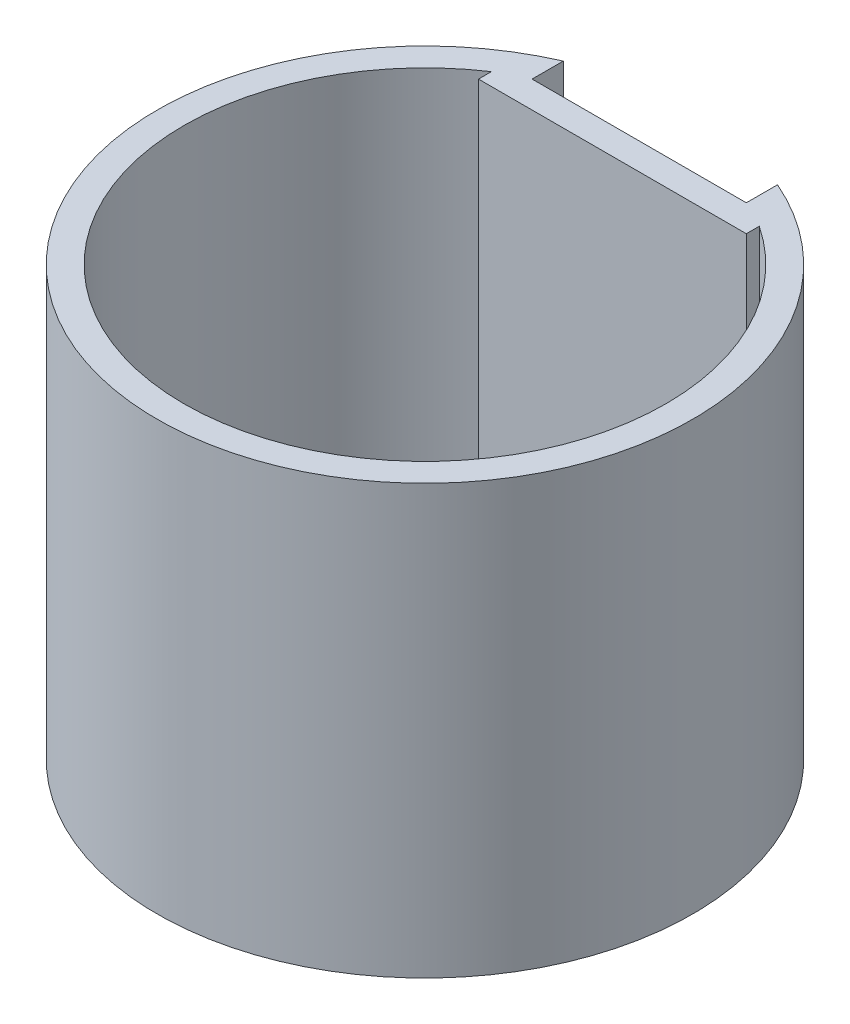
ISO-10303-21;
HEADER;
FILE_DESCRIPTION(('STEP AP214'),'2;1');
FILE_NAME('part.step','',(''),(''),'','','');
FILE_SCHEMA(('AUTOMOTIVE_DESIGN { 1 0 10303 214 1 1 1 1 }'));
ENDSEC;
DATA;
#1=APPLICATION_CONTEXT('core data for automotive mechanical design processes');
#2=APPLICATION_PROTOCOL_DEFINITION('international standard','automotive_design',2000,#1);
#3=PRODUCT_CONTEXT('',#1,'mechanical');
#4=PRODUCT('Part','Part','',(#3));
#5=PRODUCT_RELATED_PRODUCT_CATEGORY('part','',(#4));
#6=PRODUCT_DEFINITION_FORMATION('','',#4);
#7=PRODUCT_DEFINITION_CONTEXT('part definition',#1,'design');
#8=PRODUCT_DEFINITION('design','',#6,#7);
#9=PRODUCT_DEFINITION_SHAPE('','',#8);
#10=(LENGTH_UNIT() NAMED_UNIT(*) SI_UNIT(.MILLI.,.METRE.));
#11=(NAMED_UNIT(*) PLANE_ANGLE_UNIT() SI_UNIT($,.RADIAN.));
#12=(NAMED_UNIT(*) SI_UNIT($,.STERADIAN.) SOLID_ANGLE_UNIT());
#13=UNCERTAINTY_MEASURE_WITH_UNIT(LENGTH_MEASURE(1.E-05),#10,'distance_accuracy_value','');
#14=(GEOMETRIC_REPRESENTATION_CONTEXT(3) GLOBAL_UNCERTAINTY_ASSIGNED_CONTEXT((#13)) GLOBAL_UNIT_ASSIGNED_CONTEXT((#10,
#11,#12)) REPRESENTATION_CONTEXT('',''));
#15=CARTESIAN_POINT('',(0.,0.,0.));
#16=DIRECTION('',(0.,0.,1.));
#17=DIRECTION('',(1.,0.,0.));
#18=AXIS2_PLACEMENT_3D('',#15,#16,#17);
#19=CARTESIAN_POINT('',(0.,0.,0.));
#20=DIRECTION('',(0.,1.,0.));
#21=DIRECTION('',(0.,0.,1.));
#22=AXIS2_PLACEMENT_3D('',#19,#20,#21);
#23=PLANE('',#22);
#24=DIRECTION('',(0.,0.,-1.));
#25=VECTOR('',#24,1.);
#26=CARTESIAN_POINT('',(-40.,0.,-80.));
#27=LINE('',#26,#25);
#28=CARTESIAN_POINT('',(-40.,0.,-80.));
#29=VERTEX_POINT('',#28);
#30=CARTESIAN_POINT('',(-40.,0.,-91.6515138991168));
#31=VERTEX_POINT('',#30);
#32=EDGE_CURVE('E137',#29,#31,#27,.T.);
#33=ORIENTED_EDGE('',*,*,#32,.T.);
#34=CARTESIAN_POINT('',(0.,0.,0.));
#35=DIRECTION('',(0.,1.,0.));
#36=DIRECTION('',(0.,0.,1.));
#37=AXIS2_PLACEMENT_3D('',#34,#35,#36);
#38=CIRCLE('',#37,100.);
#39=CARTESIAN_POINT('',(40.,0.,-91.6515138991168));
#40=VERTEX_POINT('',#39);
#41=EDGE_CURVE('E143',#31,#40,#38,.T.);
#42=ORIENTED_EDGE('',*,*,#41,.T.);
#43=DIRECTION('',(0.,0.,-1.));
#44=VECTOR('',#43,1.);
#45=CARTESIAN_POINT('',(40.,0.,-80.));
#46=LINE('',#45,#44);
#47=CARTESIAN_POINT('',(40.,0.,-80.));
#48=VERTEX_POINT('',#47);
#49=EDGE_CURVE('E165',#48,#40,#46,.T.);
#50=ORIENTED_EDGE('',*,*,#49,.F.);
#51=DIRECTION('',(1.,0.,0.));
#52=VECTOR('',#51,1.);
#53=CARTESIAN_POINT('',(-40.,0.,-80.));
#54=LINE('',#53,#52);
#55=EDGE_CURVE('E153',#29,#48,#54,.T.);
#56=ORIENTED_EDGE('',*,*,#55,.F.);
#57=EDGE_LOOP('',(#33,#42,#50,#56));
#58=FACE_BOUND('',#57,.T.);
#59=CARTESIAN_POINT('',(0.,0.,0.));
#60=DIRECTION('',(0.,1.,0.));
#61=DIRECTION('',(0.,0.,1.));
#62=AXIS2_PLACEMENT_3D('',#59,#60,#61);
#63=CIRCLE('',#62,90.);
#64=CARTESIAN_POINT('',(-50.,0.,-74.8331477354788));
#65=VERTEX_POINT('',#64);
#66=CARTESIAN_POINT('',(50.,0.,-74.8331477354788));
#67=VERTEX_POINT('',#66);
#68=EDGE_CURVE('E131',#65,#67,#63,.T.);
#69=ORIENTED_EDGE('',*,*,#68,.F.);
#70=DIRECTION('',(0.,0.,1.));
#71=VECTOR('',#70,1.);
#72=CARTESIAN_POINT('',(-50.,0.,-74.8331477354788));
#73=LINE('',#72,#71);
#74=CARTESIAN_POINT('',(-50.,0.,-70.));
#75=VERTEX_POINT('',#74);
#76=EDGE_CURVE('E59',#65,#75,#73,.T.);
#77=ORIENTED_EDGE('',*,*,#76,.T.);
#78=DIRECTION('',(1.,0.,0.));
#79=VECTOR('',#78,1.);
#80=CARTESIAN_POINT('',(-50.,0.,-70.));
#81=LINE('',#80,#79);
#82=CARTESIAN_POINT('',(50.,0.,-70.));
#83=VERTEX_POINT('',#82);
#84=EDGE_CURVE('E135',#75,#83,#81,.T.);
#85=ORIENTED_EDGE('',*,*,#84,.T.);
#86=DIRECTION('',(0.,0.,-1.));
#87=VECTOR('',#86,1.);
#88=CARTESIAN_POINT('',(50.,0.,-70.));
#89=LINE('',#88,#87);
#90=EDGE_CURVE('E306',#83,#67,#89,.T.);
#91=ORIENTED_EDGE('',*,*,#90,.T.);
#92=EDGE_LOOP('',(#69,#77,#85,#91));
#93=FACE_BOUND('',#92,.T.);
#94=ADVANCED_FACE('F41',(#58,#93),#23,.T.);
#95=CARTESIAN_POINT('',(-40.,-160.,-80.));
#96=DIRECTION('',(1.,0.,0.));
#97=DIRECTION('',(0.,0.,-1.));
#98=AXIS2_PLACEMENT_3D('',#95,#96,#97);
#99=PLANE('',#98);
#100=ORIENTED_EDGE('',*,*,#32,.F.);
#101=DIRECTION('',(0.,1.,0.));
#102=VECTOR('',#101,1.);
#103=CARTESIAN_POINT('',(-40.,-160.,-80.));
#104=LINE('',#103,#102);
#105=CARTESIAN_POINT('',(-40.,-160.,-80.));
#106=VERTEX_POINT('',#105);
#107=EDGE_CURVE('E11',#106,#29,#104,.T.);
#108=ORIENTED_EDGE('',*,*,#107,.F.);
#109=DIRECTION('',(0.,0.,-1.));
#110=VECTOR('',#109,1.);
#111=CARTESIAN_POINT('',(-40.,-160.,-80.));
#112=LINE('',#111,#110);
#113=CARTESIAN_POINT('',(-40.,-160.,-91.6515138991168));
#114=VERTEX_POINT('',#113);
#115=EDGE_CURVE('E149',#106,#114,#112,.T.);
#116=ORIENTED_EDGE('',*,*,#115,.T.);
#117=DIRECTION('',(0.,1.,0.));
#118=VECTOR('',#117,1.);
#119=CARTESIAN_POINT('',(-40.,-160.,-91.6515138991168));
#120=LINE('',#119,#118);
#121=EDGE_CURVE('E45',#114,#31,#120,.T.);
#122=ORIENTED_EDGE('',*,*,#121,.T.);
#123=EDGE_LOOP('',(#100,#108,#116,#122));
#124=FACE_BOUND('',#123,.T.);
#125=ADVANCED_FACE('F43',(#124),#99,.T.);
#126=CARTESIAN_POINT('',(-40.,-160.,-80.));
#127=DIRECTION('',(0.,0.,1.));
#128=DIRECTION('',(1.,0.,0.));
#129=AXIS2_PLACEMENT_3D('',#126,#127,#128);
#130=PLANE('',#129);
#131=CARTESIAN_POINT('',(0.,-120.,-80.));
#132=DIRECTION('',(0.,0.,1.));
#133=DIRECTION('',(1.,0.,0.));
#134=AXIS2_PLACEMENT_3D('',#131,#132,#133);
#135=CIRCLE('',#134,7.50000000000001);
#136=CARTESIAN_POINT('',(7.50000000000001,-120.,-80.));
#137=VERTEX_POINT('',#136);
#138=EDGE_CURVE('E291',#137,#137,#135,.T.);
#139=ORIENTED_EDGE('',*,*,#138,.T.);
#140=EDGE_LOOP('',(#139));
#141=FACE_BOUND('',#140,.T.);
#142=ORIENTED_EDGE('',*,*,#55,.T.);
#143=DIRECTION('',(0.,1.,0.));
#144=VECTOR('',#143,1.);
#145=CARTESIAN_POINT('',(40.,-160.,-80.));
#146=LINE('',#145,#144);
#147=CARTESIAN_POINT('',(40.,-160.,-80.));
#148=VERTEX_POINT('',#147);
#149=EDGE_CURVE('E51',#148,#48,#146,.T.);
#150=ORIENTED_EDGE('',*,*,#149,.F.);
#151=DIRECTION('',(1.,0.,0.));
#152=VECTOR('',#151,1.);
#153=CARTESIAN_POINT('',(-40.,-160.,-80.));
#154=LINE('',#153,#152);
#155=EDGE_CURVE('E159',#106,#148,#154,.T.);
#156=ORIENTED_EDGE('',*,*,#155,.F.);
#157=ORIENTED_EDGE('',*,*,#107,.T.);
#158=EDGE_LOOP('',(#142,#150,#156,#157));
#159=FACE_BOUND('',#158,.T.);
#160=ADVANCED_FACE('F183',(#141,#159),#130,.F.);
#161=CARTESIAN_POINT('',(40.,-160.,-80.));
#162=DIRECTION('',(1.,0.,0.));
#163=DIRECTION('',(0.,0.,-1.));
#164=AXIS2_PLACEMENT_3D('',#161,#162,#163);
#165=PLANE('',#164);
#166=ORIENTED_EDGE('',*,*,#49,.T.);
#167=DIRECTION('',(0.,1.,0.));
#168=VECTOR('',#167,1.);
#169=CARTESIAN_POINT('',(40.,-160.,-91.6515138991168));
#170=LINE('',#169,#168);
#171=CARTESIAN_POINT('',(40.,-160.,-91.6515138991168));
#172=VERTEX_POINT('',#171);
#173=EDGE_CURVE('E173',#172,#40,#170,.T.);
#174=ORIENTED_EDGE('',*,*,#173,.F.);
#175=DIRECTION('',(0.,0.,-1.));
#176=VECTOR('',#175,1.);
#177=CARTESIAN_POINT('',(40.,-160.,-80.));
#178=LINE('',#177,#176);
#179=EDGE_CURVE('E156',#148,#172,#178,.T.);
#180=ORIENTED_EDGE('',*,*,#179,.F.);
#181=ORIENTED_EDGE('',*,*,#149,.T.);
#182=EDGE_LOOP('',(#166,#174,#180,#181));
#183=FACE_BOUND('',#182,.T.);
#184=ADVANCED_FACE('F186',(#183),#165,.F.);
#185=CARTESIAN_POINT('',(0.,-160.,0.));
#186=DIRECTION('',(0.,1.,0.));
#187=DIRECTION('',(0.,0.,1.));
#188=AXIS2_PLACEMENT_3D('',#185,#186,#187);
#189=CYLINDRICAL_SURFACE('',#188,100.);
#190=ORIENTED_EDGE('',*,*,#41,.F.);
#191=ORIENTED_EDGE('',*,*,#121,.F.);
#192=CARTESIAN_POINT('',(0.,-160.,0.));
#193=DIRECTION('',(0.,1.,0.));
#194=DIRECTION('',(0.,0.,1.));
#195=AXIS2_PLACEMENT_3D('',#192,#193,#194);
#196=CIRCLE('',#195,100.);
#197=EDGE_CURVE('E152',#114,#172,#196,.T.);
#198=ORIENTED_EDGE('',*,*,#197,.T.);
#199=ORIENTED_EDGE('',*,*,#173,.T.);
#200=EDGE_LOOP('',(#190,#191,#198,#199));
#201=FACE_BOUND('',#200,.T.);
#202=ADVANCED_FACE('F178',(#201),#189,.T.);
#203=CARTESIAN_POINT('',(0.,-160.,0.));
#204=DIRECTION('',(0.,1.,0.));
#205=DIRECTION('',(0.,0.,1.));
#206=AXIS2_PLACEMENT_3D('',#203,#204,#205);
#207=PLANE('',#206);
#208=ORIENTED_EDGE('',*,*,#115,.F.);
#209=ORIENTED_EDGE('',*,*,#155,.T.);
#210=ORIENTED_EDGE('',*,*,#179,.T.);
#211=ORIENTED_EDGE('',*,*,#197,.F.);
#212=EDGE_LOOP('',(#208,#209,#210,#211));
#213=FACE_BOUND('',#212,.T.);
#214=ADVANCED_FACE('F188',(#213),#207,.F.);
#215=CARTESIAN_POINT('',(-50.,-150.,-74.8331477354788));
#216=DIRECTION('',(-1.,0.,0.));
#217=DIRECTION('',(0.,0.,1.));
#218=AXIS2_PLACEMENT_3D('',#215,#216,#217);
#219=PLANE('',#218);
#220=ORIENTED_EDGE('',*,*,#76,.F.);
#221=DIRECTION('',(0.,1.,0.));
#222=VECTOR('',#221,1.);
#223=CARTESIAN_POINT('',(-50.,-150.,-74.8331477354788));
#224=LINE('',#223,#222);
#225=CARTESIAN_POINT('',(-50.,-150.,-74.8331477354788));
#226=VERTEX_POINT('',#225);
#227=EDGE_CURVE('E129',#226,#65,#224,.T.);
#228=ORIENTED_EDGE('',*,*,#227,.F.);
#229=DIRECTION('',(0.,0.,1.));
#230=VECTOR('',#229,1.);
#231=CARTESIAN_POINT('',(-50.,-150.,-74.8331477354788));
#232=LINE('',#231,#230);
#233=CARTESIAN_POINT('',(-50.,-150.,-70.));
#234=VERTEX_POINT('',#233);
#235=EDGE_CURVE('E119',#226,#234,#232,.T.);
#236=ORIENTED_EDGE('',*,*,#235,.T.);
#237=DIRECTION('',(0.,1.,0.));
#238=VECTOR('',#237,1.);
#239=CARTESIAN_POINT('',(-50.,-150.,-70.));
#240=LINE('',#239,#238);
#241=EDGE_CURVE('E128',#234,#75,#240,.T.);
#242=ORIENTED_EDGE('',*,*,#241,.T.);
#243=EDGE_LOOP('',(#220,#228,#236,#242));
#244=FACE_BOUND('',#243,.T.);
#245=ADVANCED_FACE('F127',(#244),#219,.T.);
#246=CARTESIAN_POINT('',(-50.,-150.,-70.));
#247=DIRECTION('',(0.,0.,1.));
#248=DIRECTION('',(1.,0.,0.));
#249=AXIS2_PLACEMENT_3D('',#246,#247,#248);
#250=PLANE('',#249);
#251=CARTESIAN_POINT('',(0.,-120.,-70.));
#252=DIRECTION('',(0.,0.,1.));
#253=DIRECTION('',(1.,0.,0.));
#254=AXIS2_PLACEMENT_3D('',#251,#252,#253);
#255=CIRCLE('',#254,7.50000000000001);
#256=CARTESIAN_POINT('',(7.50000000000001,-120.,-70.));
#257=VERTEX_POINT('',#256);
#258=EDGE_CURVE('E288',#257,#257,#255,.T.);
#259=ORIENTED_EDGE('',*,*,#258,.F.);
#260=EDGE_LOOP('',(#259));
#261=FACE_BOUND('',#260,.T.);
#262=ORIENTED_EDGE('',*,*,#84,.F.);
#263=ORIENTED_EDGE('',*,*,#241,.F.);
#264=DIRECTION('',(1.,0.,0.));
#265=VECTOR('',#264,1.);
#266=CARTESIAN_POINT('',(-50.,-150.,-70.));
#267=LINE('',#266,#265);
#268=CARTESIAN_POINT('',(50.,-150.,-70.));
#269=VERTEX_POINT('',#268);
#270=EDGE_CURVE('E115',#234,#269,#267,.T.);
#271=ORIENTED_EDGE('',*,*,#270,.T.);
#272=DIRECTION('',(0.,1.,0.));
#273=VECTOR('',#272,1.);
#274=CARTESIAN_POINT('',(50.,-150.,-70.));
#275=LINE('',#274,#273);
#276=EDGE_CURVE('E138',#269,#83,#275,.T.);
#277=ORIENTED_EDGE('',*,*,#276,.T.);
#278=EDGE_LOOP('',(#262,#263,#271,#277));
#279=FACE_BOUND('',#278,.T.);
#280=ADVANCED_FACE('F133',(#261,#279),#250,.T.);
#281=CARTESIAN_POINT('',(50.,-150.,-70.));
#282=DIRECTION('',(1.,0.,0.));
#283=DIRECTION('',(0.,0.,-1.));
#284=AXIS2_PLACEMENT_3D('',#281,#282,#283);
#285=PLANE('',#284);
#286=ORIENTED_EDGE('',*,*,#90,.F.);
#287=ORIENTED_EDGE('',*,*,#276,.F.);
#288=DIRECTION('',(0.,0.,-1.));
#289=VECTOR('',#288,1.);
#290=CARTESIAN_POINT('',(50.,-150.,-70.));
#291=LINE('',#290,#289);
#292=CARTESIAN_POINT('',(50.,-150.,-74.8331477354788));
#293=VERTEX_POINT('',#292);
#294=EDGE_CURVE('E121',#269,#293,#291,.T.);
#295=ORIENTED_EDGE('',*,*,#294,.T.);
#296=DIRECTION('',(0.,1.,0.));
#297=VECTOR('',#296,1.);
#298=CARTESIAN_POINT('',(50.,-150.,-74.8331477354788));
#299=LINE('',#298,#297);
#300=EDGE_CURVE('E145',#293,#67,#299,.T.);
#301=ORIENTED_EDGE('',*,*,#300,.T.);
#302=EDGE_LOOP('',(#286,#287,#295,#301));
#303=FACE_BOUND('',#302,.T.);
#304=ADVANCED_FACE('F236',(#303),#285,.T.);
#305=CARTESIAN_POINT('',(0.,-150.,0.));
#306=DIRECTION('',(0.,1.,0.));
#307=DIRECTION('',(0.,0.,1.));
#308=AXIS2_PLACEMENT_3D('',#305,#306,#307);
#309=CYLINDRICAL_SURFACE('',#308,90.);
#310=ORIENTED_EDGE('',*,*,#68,.T.);
#311=ORIENTED_EDGE('',*,*,#300,.F.);
#312=CARTESIAN_POINT('',(0.,-150.,0.));
#313=DIRECTION('',(0.,1.,0.));
#314=DIRECTION('',(0.,0.,1.));
#315=AXIS2_PLACEMENT_3D('',#312,#313,#314);
#316=CIRCLE('',#315,90.);
#317=EDGE_CURVE('E299',#226,#293,#316,.T.);
#318=ORIENTED_EDGE('',*,*,#317,.F.);
#319=ORIENTED_EDGE('',*,*,#227,.T.);
#320=EDGE_LOOP('',(#310,#311,#318,#319));
#321=FACE_BOUND('',#320,.T.);
#322=ADVANCED_FACE('F241',(#321),#309,.F.);
#323=CARTESIAN_POINT('',(0.,-150.,0.));
#324=DIRECTION('',(0.,1.,0.));
#325=DIRECTION('',(0.,0.,1.));
#326=AXIS2_PLACEMENT_3D('',#323,#324,#325);
#327=PLANE('',#326);
#328=ORIENTED_EDGE('',*,*,#235,.F.);
#329=ORIENTED_EDGE('',*,*,#317,.T.);
#330=ORIENTED_EDGE('',*,*,#294,.F.);
#331=ORIENTED_EDGE('',*,*,#270,.F.);
#332=EDGE_LOOP('',(#328,#329,#330,#331));
#333=FACE_BOUND('',#332,.T.);
#334=ADVANCED_FACE('F117',(#333),#327,.T.);
#335=CARTESIAN_POINT('',(0.,-120.,-70.));
#336=DIRECTION('',(0.,0.,-1.));
#337=DIRECTION('',(-1.,0.,0.));
#338=AXIS2_PLACEMENT_3D('',#335,#336,#337);
#339=CYLINDRICAL_SURFACE('',#338,7.50000000000001);
#340=ORIENTED_EDGE('',*,*,#258,.T.);
#341=EDGE_LOOP('',(#340));
#342=FACE_BOUND('',#341,.T.);
#343=ORIENTED_EDGE('',*,*,#138,.F.);
#344=EDGE_LOOP('',(#343));
#345=FACE_BOUND('',#344,.T.);
#346=ADVANCED_FACE('F259',(#342,#345),#339,.F.);
#347=CLOSED_SHELL('',(#94,#125,#160,#184,#202,#214,#245,#280,#304,#322,#334,#346));
#348=MANIFOLD_SOLID_BREP('B2',#347);
#349=ADVANCED_BREP_SHAPE_REPRESENTATION('',(#18,#348),#14);
#350=SHAPE_DEFINITION_REPRESENTATION(#9,#349);
ENDSEC;
END-ISO-10303-21;
